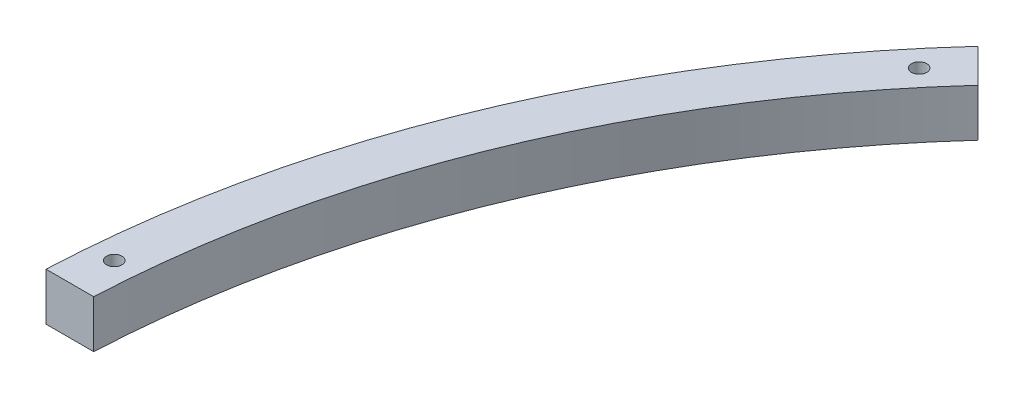
ISO-10303-21;
HEADER;
FILE_DESCRIPTION(('STEP AP214'),'2;1');
FILE_NAME('part.step','',(''),(''),'','','');
FILE_SCHEMA(('AUTOMOTIVE_DESIGN { 1 0 10303 214 1 1 1 1 }'));
ENDSEC;
DATA;
#1=APPLICATION_CONTEXT('core data for automotive mechanical design processes');
#2=APPLICATION_PROTOCOL_DEFINITION('international standard','automotive_design',2000,#1);
#3=PRODUCT_CONTEXT('',#1,'mechanical');
#4=PRODUCT('Part','Part','',(#3));
#5=PRODUCT_RELATED_PRODUCT_CATEGORY('part','',(#4));
#6=PRODUCT_DEFINITION_FORMATION('','',#4);
#7=PRODUCT_DEFINITION_CONTEXT('part definition',#1,'design');
#8=PRODUCT_DEFINITION('design','',#6,#7);
#9=PRODUCT_DEFINITION_SHAPE('','',#8);
#10=(LENGTH_UNIT() NAMED_UNIT(*) SI_UNIT(.MILLI.,.METRE.));
#11=(NAMED_UNIT(*) PLANE_ANGLE_UNIT() SI_UNIT($,.RADIAN.));
#12=(NAMED_UNIT(*) SI_UNIT($,.STERADIAN.) SOLID_ANGLE_UNIT());
#13=UNCERTAINTY_MEASURE_WITH_UNIT(LENGTH_MEASURE(1.E-05),#10,'distance_accuracy_value','');
#14=(GEOMETRIC_REPRESENTATION_CONTEXT(3) GLOBAL_UNCERTAINTY_ASSIGNED_CONTEXT((#13)) GLOBAL_UNIT_ASSIGNED_CONTEXT((#10,
#11,#12)) REPRESENTATION_CONTEXT('',''));
#15=CARTESIAN_POINT('',(0.,0.,0.));
#16=DIRECTION('',(0.,0.,1.));
#17=DIRECTION('',(1.,0.,0.));
#18=AXIS2_PLACEMENT_3D('',#15,#16,#17);
#19=CARTESIAN_POINT('',(0.,5.,0.));
#20=DIRECTION('',(0.,-1.,0.));
#21=DIRECTION('',(0.,0.,-1.));
#22=AXIS2_PLACEMENT_3D('',#19,#20,#21);
#23=CYLINDRICAL_SURFACE('',#22,210.);
#24=CARTESIAN_POINT('',(0.,-5.,0.));
#25=DIRECTION('',(0.,1.,0.));
#26=DIRECTION('',(0.,0.,1.));
#27=AXIS2_PLACEMENT_3D('',#24,#25,#26);
#28=CIRCLE('',#27,210.);
#29=CARTESIAN_POINT('',(-155.395037553779,-5.,-141.252901930048));
#30=VERTEX_POINT('',#29);
#31=CARTESIAN_POINT('',(-209.76176963403,-5.,-10.));
#32=VERTEX_POINT('',#31);
#33=EDGE_CURVE('E101',#30,#32,#28,.T.);
#34=ORIENTED_EDGE('',*,*,#33,.F.);
#35=DIRECTION('',(0.,-1.,0.));
#36=VECTOR('',#35,1.);
#37=CARTESIAN_POINT('',(-155.395037553779,5.,-141.252901930048));
#38=LINE('',#37,#36);
#39=CARTESIAN_POINT('',(-155.395037553779,5.,-141.252901930048));
#40=VERTEX_POINT('',#39);
#41=EDGE_CURVE('E11',#40,#30,#38,.T.);
#42=ORIENTED_EDGE('',*,*,#41,.F.);
#43=CARTESIAN_POINT('',(0.,5.,0.));
#44=DIRECTION('',(0.,1.,0.));
#45=DIRECTION('',(0.,0.,1.));
#46=AXIS2_PLACEMENT_3D('',#43,#44,#45);
#47=CIRCLE('',#46,210.);
#48=CARTESIAN_POINT('',(-209.76176963403,5.,-10.));
#49=VERTEX_POINT('',#48);
#50=EDGE_CURVE('E94',#40,#49,#47,.T.);
#51=ORIENTED_EDGE('',*,*,#50,.T.);
#52=DIRECTION('',(0.,-1.,0.));
#53=VECTOR('',#52,1.);
#54=CARTESIAN_POINT('',(-209.76176963403,5.,-10.));
#55=LINE('',#54,#53);
#56=EDGE_CURVE('E75',#49,#32,#55,.T.);
#57=ORIENTED_EDGE('',*,*,#56,.T.);
#58=EDGE_LOOP('',(#34,#42,#51,#57));
#59=FACE_BOUND('',#58,.T.);
#60=ADVANCED_FACE('F37',(#59),#23,.F.);
#61=CARTESIAN_POINT('',(-7.07106781186545,5.,7.07106781186545));
#62=DIRECTION('',(0.707106781186548,0.,-0.707106781186548));
#63=DIRECTION('',(-0.707106781186548,0.,-0.707106781186548));
#64=AXIS2_PLACEMENT_3D('',#61,#62,#63);
#65=PLANE('',#64);
#66=DIRECTION('',(0.707106781186548,0.,0.707106781186548));
#67=VECTOR('',#66,1.);
#68=CARTESIAN_POINT('',(-7.07106781186545,-5.,7.07106781186545));
#69=LINE('',#68,#67);
#70=CARTESIAN_POINT('',(-162.473770491066,-5.,-148.331634867335));
#71=VERTEX_POINT('',#70);
#72=EDGE_CURVE('E88',#71,#30,#69,.T.);
#73=ORIENTED_EDGE('',*,*,#72,.F.);
#74=DIRECTION('',(0.,-1.,0.));
#75=VECTOR('',#74,1.);
#76=CARTESIAN_POINT('',(-162.473770491066,5.,-148.331634867335));
#77=LINE('',#76,#75);
#78=CARTESIAN_POINT('',(-162.473770491066,5.,-148.331634867335));
#79=VERTEX_POINT('',#78);
#80=EDGE_CURVE('E45',#79,#71,#77,.T.);
#81=ORIENTED_EDGE('',*,*,#80,.F.);
#82=DIRECTION('',(0.707106781186548,0.,0.707106781186548));
#83=VECTOR('',#82,1.);
#84=CARTESIAN_POINT('',(-7.07106781186545,5.,7.07106781186545));
#85=LINE('',#84,#83);
#86=EDGE_CURVE('E86',#79,#40,#85,.T.);
#87=ORIENTED_EDGE('',*,*,#86,.T.);
#88=ORIENTED_EDGE('',*,*,#41,.T.);
#89=EDGE_LOOP('',(#73,#81,#87,#88));
#90=FACE_BOUND('',#89,.T.);
#91=ADVANCED_FACE('F84',(#90),#65,.T.);
#92=CARTESIAN_POINT('',(0.,5.,0.));
#93=DIRECTION('',(0.,-1.,0.));
#94=DIRECTION('',(0.,0.,-1.));
#95=AXIS2_PLACEMENT_3D('',#92,#93,#94);
#96=CYLINDRICAL_SURFACE('',#95,220.);
#97=CARTESIAN_POINT('',(0.,-5.,0.));
#98=DIRECTION('',(0.,1.,0.));
#99=DIRECTION('',(0.,0.,1.));
#100=AXIS2_PLACEMENT_3D('',#97,#98,#99);
#101=CIRCLE('',#100,220.);
#102=CARTESIAN_POINT('',(-219.772609758359,-5.,-10.));
#103=VERTEX_POINT('',#102);
#104=EDGE_CURVE('E68',#71,#103,#101,.T.);
#105=ORIENTED_EDGE('',*,*,#104,.T.);
#106=DIRECTION('',(0.,-1.,0.));
#107=VECTOR('',#106,1.);
#108=CARTESIAN_POINT('',(-219.772609758359,5.,-10.));
#109=LINE('',#108,#107);
#110=CARTESIAN_POINT('',(-219.772609758359,5.,-10.));
#111=VERTEX_POINT('',#110);
#112=EDGE_CURVE('E89',#111,#103,#109,.T.);
#113=ORIENTED_EDGE('',*,*,#112,.F.);
#114=CARTESIAN_POINT('',(0.,5.,0.));
#115=DIRECTION('',(0.,1.,0.));
#116=DIRECTION('',(0.,0.,1.));
#117=AXIS2_PLACEMENT_3D('',#114,#115,#116);
#118=CIRCLE('',#117,220.);
#119=EDGE_CURVE('E90',#79,#111,#118,.T.);
#120=ORIENTED_EDGE('',*,*,#119,.F.);
#121=ORIENTED_EDGE('',*,*,#80,.T.);
#122=EDGE_LOOP('',(#105,#113,#120,#121));
#123=FACE_BOUND('',#122,.T.);
#124=ADVANCED_FACE('F91',(#123),#96,.T.);
#125=CARTESIAN_POINT('',(0.,5.,-10.));
#126=DIRECTION('',(0.,0.,-1.));
#127=DIRECTION('',(-1.,0.,0.));
#128=AXIS2_PLACEMENT_3D('',#125,#126,#127);
#129=PLANE('',#128);
#130=DIRECTION('',(1.,0.,0.));
#131=VECTOR('',#130,1.);
#132=CARTESIAN_POINT('',(0.,-5.,-10.));
#133=LINE('',#132,#131);
#134=EDGE_CURVE('E96',#103,#32,#133,.T.);
#135=ORIENTED_EDGE('',*,*,#134,.T.);
#136=ORIENTED_EDGE('',*,*,#56,.F.);
#137=DIRECTION('',(1.,0.,0.));
#138=VECTOR('',#137,1.);
#139=CARTESIAN_POINT('',(0.,5.,-10.));
#140=LINE('',#139,#138);
#141=EDGE_CURVE('E53',#111,#49,#140,.T.);
#142=ORIENTED_EDGE('',*,*,#141,.F.);
#143=ORIENTED_EDGE('',*,*,#112,.T.);
#144=EDGE_LOOP('',(#135,#136,#142,#143));
#145=FACE_BOUND('',#144,.T.);
#146=ADVANCED_FACE('F111',(#145),#129,.F.);
#147=CARTESIAN_POINT('',(0.,5.,0.));
#148=DIRECTION('',(0.,1.,0.));
#149=DIRECTION('',(0.,0.,1.));
#150=AXIS2_PLACEMENT_3D('',#147,#148,#149);
#151=PLANE('',#150);
#152=CARTESIAN_POINT('',(-164.699555270579,5.,-138.199336082607));
#153=DIRECTION('',(0.,1.,0.));
#154=DIRECTION('',(0.,0.,1.));
#155=AXIS2_PLACEMENT_3D('',#152,#153,#154);
#156=CIRCLE('',#155,1.59999999999999);
#157=CARTESIAN_POINT('',(-164.699555270579,5.,-136.599336082607));
#158=VERTEX_POINT('',#157);
#159=EDGE_CURVE('E146',#158,#158,#156,.T.);
#160=ORIENTED_EDGE('',*,*,#159,.F.);
#161=EDGE_LOOP('',(#160));
#162=FACE_BOUND('',#161,.T.);
#163=CARTESIAN_POINT('',(-214.181860089725,5.,-18.738484690745));
#164=DIRECTION('',(0.,1.,0.));
#165=DIRECTION('',(0.,0.,1.));
#166=AXIS2_PLACEMENT_3D('',#163,#164,#165);
#167=CIRCLE('',#166,1.59999999999999);
#168=CARTESIAN_POINT('',(-214.181860089725,5.,-17.138484690745));
#169=VERTEX_POINT('',#168);
#170=EDGE_CURVE('E148',#169,#169,#167,.T.);
#171=ORIENTED_EDGE('',*,*,#170,.F.);
#172=EDGE_LOOP('',(#171));
#173=FACE_BOUND('',#172,.T.);
#174=ORIENTED_EDGE('',*,*,#50,.F.);
#175=ORIENTED_EDGE('',*,*,#86,.F.);
#176=ORIENTED_EDGE('',*,*,#119,.T.);
#177=ORIENTED_EDGE('',*,*,#141,.T.);
#178=EDGE_LOOP('',(#174,#175,#176,#177));
#179=FACE_BOUND('',#178,.T.);
#180=ADVANCED_FACE('F93',(#162,#173,#179),#151,.T.);
#181=CARTESIAN_POINT('',(0.,-5.,0.));
#182=DIRECTION('',(0.,1.,0.));
#183=DIRECTION('',(0.,0.,1.));
#184=AXIS2_PLACEMENT_3D('',#181,#182,#183);
#185=PLANE('',#184);
#186=CARTESIAN_POINT('',(-164.699555270579,-5.,-138.199336082607));
#187=DIRECTION('',(0.,1.,0.));
#188=DIRECTION('',(0.,0.,1.));
#189=AXIS2_PLACEMENT_3D('',#186,#187,#188);
#190=CIRCLE('',#189,1.59999999999999);
#191=CARTESIAN_POINT('',(-164.699555270579,-5.,-136.599336082607));
#192=VERTEX_POINT('',#191);
#193=EDGE_CURVE('E143',#192,#192,#190,.T.);
#194=ORIENTED_EDGE('',*,*,#193,.T.);
#195=EDGE_LOOP('',(#194));
#196=FACE_BOUND('',#195,.T.);
#197=CARTESIAN_POINT('',(-214.181860089725,-5.,-18.738484690745));
#198=DIRECTION('',(0.,1.,0.));
#199=DIRECTION('',(0.,0.,1.));
#200=AXIS2_PLACEMENT_3D('',#197,#198,#199);
#201=CIRCLE('',#200,1.59999999999999);
#202=CARTESIAN_POINT('',(-214.181860089725,-5.,-17.138484690745));
#203=VERTEX_POINT('',#202);
#204=EDGE_CURVE('E104',#203,#203,#201,.T.);
#205=ORIENTED_EDGE('',*,*,#204,.T.);
#206=EDGE_LOOP('',(#205));
#207=FACE_BOUND('',#206,.T.);
#208=ORIENTED_EDGE('',*,*,#33,.T.);
#209=ORIENTED_EDGE('',*,*,#134,.F.);
#210=ORIENTED_EDGE('',*,*,#104,.F.);
#211=ORIENTED_EDGE('',*,*,#72,.T.);
#212=EDGE_LOOP('',(#208,#209,#210,#211));
#213=FACE_BOUND('',#212,.T.);
#214=ADVANCED_FACE('F113',(#196,#207,#213),#185,.F.);
#215=CARTESIAN_POINT('',(-214.181860089725,5.,-18.738484690745));
#216=DIRECTION('',(0.,1.,0.));
#217=DIRECTION('',(0.,0.,1.));
#218=AXIS2_PLACEMENT_3D('',#215,#216,#217);
#219=CYLINDRICAL_SURFACE('',#218,1.59999999999999);
#220=ORIENTED_EDGE('',*,*,#204,.F.);
#221=EDGE_LOOP('',(#220));
#222=FACE_BOUND('',#221,.T.);
#223=ORIENTED_EDGE('',*,*,#170,.T.);
#224=EDGE_LOOP('',(#223));
#225=FACE_BOUND('',#224,.T.);
#226=ADVANCED_FACE('F127',(#222,#225),#219,.F.);
#227=CARTESIAN_POINT('',(-164.699555270579,5.,-138.199336082607));
#228=DIRECTION('',(0.,1.,0.));
#229=DIRECTION('',(0.,0.,1.));
#230=AXIS2_PLACEMENT_3D('',#227,#228,#229);
#231=CYLINDRICAL_SURFACE('',#230,1.59999999999999);
#232=ORIENTED_EDGE('',*,*,#193,.F.);
#233=EDGE_LOOP('',(#232));
#234=FACE_BOUND('',#233,.T.);
#235=ORIENTED_EDGE('',*,*,#159,.T.);
#236=EDGE_LOOP('',(#235));
#237=FACE_BOUND('',#236,.T.);
#238=ADVANCED_FACE('F134',(#234,#237),#231,.F.);
#239=CLOSED_SHELL('',(#60,#91,#124,#146,#180,#214,#226,#238));
#240=MANIFOLD_SOLID_BREP('B2',#239);
#241=ADVANCED_BREP_SHAPE_REPRESENTATION('',(#18,#240),#14);
#242=SHAPE_DEFINITION_REPRESENTATION(#9,#241);
ENDSEC;
END-ISO-10303-21;
